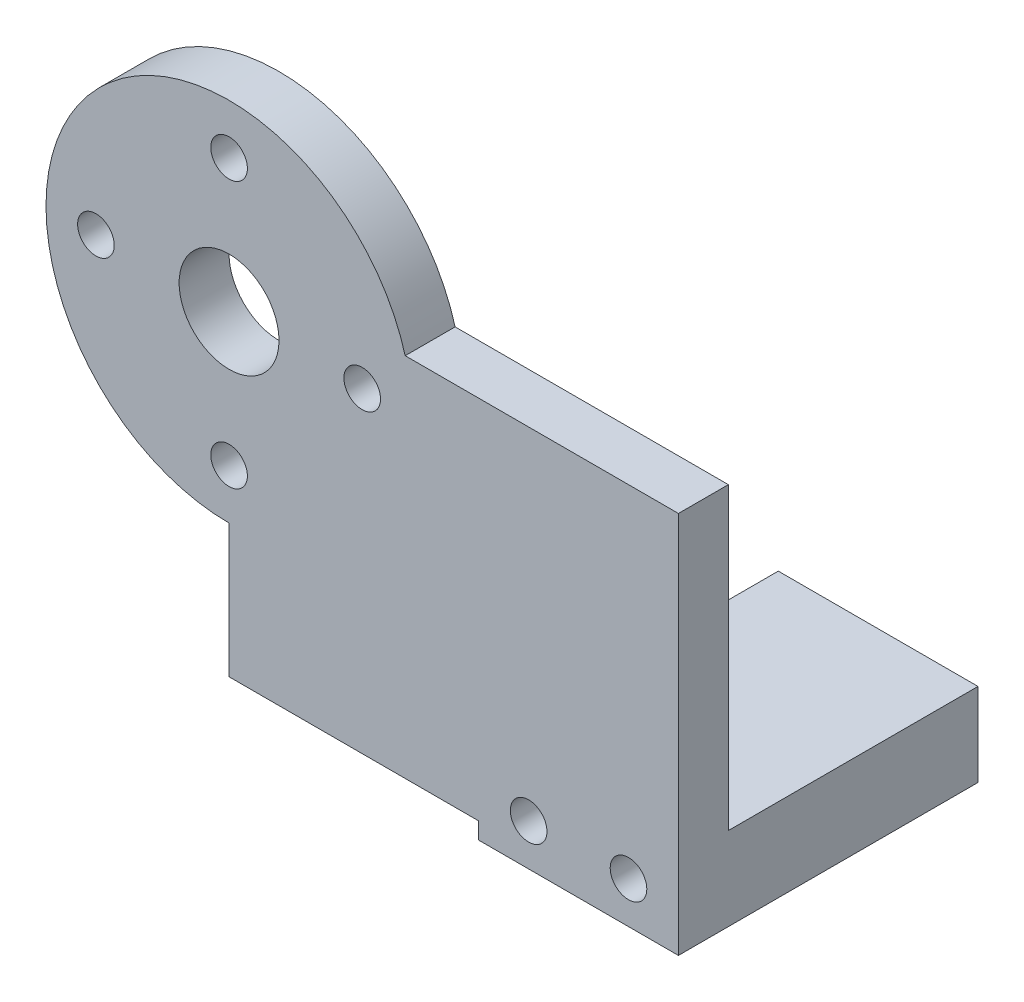
ISO-10303-21;
HEADER;
FILE_DESCRIPTION(('STEP AP214'),'2;1');
FILE_NAME('part.step','',(''),(''),'','','');
FILE_SCHEMA(('AUTOMOTIVE_DESIGN { 1 0 10303 214 1 1 1 1 }'));
ENDSEC;
DATA;
#1=APPLICATION_CONTEXT('core data for automotive mechanical design processes');
#2=APPLICATION_PROTOCOL_DEFINITION('international standard','automotive_design',2000,#1);
#3=PRODUCT_CONTEXT('',#1,'mechanical');
#4=PRODUCT('Part','Part','',(#3));
#5=PRODUCT_RELATED_PRODUCT_CATEGORY('part','',(#4));
#6=PRODUCT_DEFINITION_FORMATION('','',#4);
#7=PRODUCT_DEFINITION_CONTEXT('part definition',#1,'design');
#8=PRODUCT_DEFINITION('design','',#6,#7);
#9=PRODUCT_DEFINITION_SHAPE('','',#8);
#10=(LENGTH_UNIT() NAMED_UNIT(*) SI_UNIT(.MILLI.,.METRE.));
#11=(NAMED_UNIT(*) PLANE_ANGLE_UNIT() SI_UNIT($,.RADIAN.));
#12=(NAMED_UNIT(*) SI_UNIT($,.STERADIAN.) SOLID_ANGLE_UNIT());
#13=UNCERTAINTY_MEASURE_WITH_UNIT(LENGTH_MEASURE(1.E-05),#10,'distance_accuracy_value','');
#14=(GEOMETRIC_REPRESENTATION_CONTEXT(3) GLOBAL_UNCERTAINTY_ASSIGNED_CONTEXT((#13)) GLOBAL_UNIT_ASSIGNED_CONTEXT((#10,
#11,#12)) REPRESENTATION_CONTEXT('',''));
#15=CARTESIAN_POINT('',(0.,0.,0.));
#16=DIRECTION('',(0.,0.,1.));
#17=DIRECTION('',(1.,0.,0.));
#18=AXIS2_PLACEMENT_3D('',#15,#16,#17);
#19=CARTESIAN_POINT('',(0.,0.,15.));
#20=DIRECTION('',(0.,0.,1.));
#21=DIRECTION('',(1.,0.,0.));
#22=AXIS2_PLACEMENT_3D('',#19,#20,#21);
#23=PLANE('',#22);
#24=CARTESIAN_POINT('',(0.,-8.,15.));
#25=DIRECTION('',(0.,0.,1.));
#26=DIRECTION('',(1.,0.,0.));
#27=AXIS2_PLACEMENT_3D('',#24,#25,#26);
#28=CIRCLE('',#27,1.1);
#29=CARTESIAN_POINT('',(1.1,-8.,15.));
#30=VERTEX_POINT('',#29);
#31=EDGE_CURVE('E250',#30,#30,#28,.F.);
#32=ORIENTED_EDGE('',*,*,#31,.F.);
#33=EDGE_LOOP('',(#32));
#34=FACE_BOUND('',#33,.T.);
#35=CARTESIAN_POINT('',(0.,8.,15.));
#36=DIRECTION('',(0.,0.,1.));
#37=DIRECTION('',(1.,0.,0.));
#38=AXIS2_PLACEMENT_3D('',#35,#36,#37);
#39=CIRCLE('',#38,1.1);
#40=CARTESIAN_POINT('',(1.1,8.,15.));
#41=VERTEX_POINT('',#40);
#42=EDGE_CURVE('E243',#41,#41,#39,.F.);
#43=ORIENTED_EDGE('',*,*,#42,.F.);
#44=EDGE_LOOP('',(#43));
#45=FACE_BOUND('',#44,.T.);
#46=CARTESIAN_POINT('',(-8.,0.,15.));
#47=DIRECTION('',(0.,0.,1.));
#48=DIRECTION('',(1.,0.,0.));
#49=AXIS2_PLACEMENT_3D('',#46,#47,#48);
#50=CIRCLE('',#49,1.1);
#51=CARTESIAN_POINT('',(-6.9,0.,15.));
#52=VERTEX_POINT('',#51);
#53=EDGE_CURVE('E239',#52,#52,#50,.F.);
#54=ORIENTED_EDGE('',*,*,#53,.F.);
#55=EDGE_LOOP('',(#54));
#56=FACE_BOUND('',#55,.T.);
#57=CARTESIAN_POINT('',(8.,0.,15.));
#58=DIRECTION('',(0.,0.,1.));
#59=DIRECTION('',(1.,0.,0.));
#60=AXIS2_PLACEMENT_3D('',#57,#58,#59);
#61=CIRCLE('',#60,1.1);
#62=CARTESIAN_POINT('',(9.1,0.,15.));
#63=VERTEX_POINT('',#62);
#64=EDGE_CURVE('E221',#63,#63,#61,.F.);
#65=ORIENTED_EDGE('',*,*,#64,.F.);
#66=EDGE_LOOP('',(#65));
#67=FACE_BOUND('',#66,.T.);
#68=CARTESIAN_POINT('',(0.,0.,15.));
#69=DIRECTION('',(0.,0.,1.));
#70=DIRECTION('',(1.,0.,0.));
#71=AXIS2_PLACEMENT_3D('',#68,#69,#70);
#72=CIRCLE('',#71,3.);
#73=CARTESIAN_POINT('',(3.,0.,15.));
#74=VERTEX_POINT('',#73);
#75=EDGE_CURVE('E254',#74,#74,#72,.F.);
#76=ORIENTED_EDGE('',*,*,#75,.F.);
#77=EDGE_LOOP('',(#76));
#78=FACE_BOUND('',#77,.T.);
#79=DIRECTION('',(0.,1.,0.));
#80=VECTOR('',#79,1.);
#81=CARTESIAN_POINT('',(15.,0.,15.));
#82=LINE('',#81,#80);
#83=CARTESIAN_POINT('',(15.,-19.,15.));
#84=VERTEX_POINT('',#83);
#85=CARTESIAN_POINT('',(15.,-15.,15.));
#86=VERTEX_POINT('',#85);
#87=EDGE_CURVE('E145',#84,#86,#82,.T.);
#88=ORIENTED_EDGE('',*,*,#87,.F.);
#89=DIRECTION('',(1.,0.,0.));
#90=VECTOR('',#89,1.);
#91=CARTESIAN_POINT('',(0.,-19.,15.));
#92=LINE('',#91,#90);
#93=CARTESIAN_POINT('',(0.,-19.,15.));
#94=VERTEX_POINT('',#93);
#95=EDGE_CURVE('E168',#94,#84,#92,.T.);
#96=ORIENTED_EDGE('',*,*,#95,.F.);
#97=DIRECTION('',(0.,-1.,0.));
#98=VECTOR('',#97,1.);
#99=CARTESIAN_POINT('',(0.,-19.,15.));
#100=LINE('',#99,#98);
#101=CARTESIAN_POINT('',(0.,-11.,15.));
#102=VERTEX_POINT('',#101);
#103=EDGE_CURVE('E146',#102,#94,#100,.T.);
#104=ORIENTED_EDGE('',*,*,#103,.F.);
#105=CARTESIAN_POINT('',(0.,0.,15.));
#106=DIRECTION('',(0.,0.,1.));
#107=DIRECTION('',(1.,0.,0.));
#108=AXIS2_PLACEMENT_3D('',#105,#106,#107);
#109=CIRCLE('',#108,11.);
#110=CARTESIAN_POINT('',(10.5830052442584,3.,15.));
#111=VERTEX_POINT('',#110);
#112=EDGE_CURVE('E189',#111,#102,#109,.T.);
#113=ORIENTED_EDGE('',*,*,#112,.F.);
#114=DIRECTION('',(-1.,0.,0.));
#115=VECTOR('',#114,1.);
#116=CARTESIAN_POINT('',(0.,3.,15.));
#117=LINE('',#116,#115);
#118=CARTESIAN_POINT('',(27.,3.,15.));
#119=VERTEX_POINT('',#118);
#120=EDGE_CURVE('E160',#119,#111,#117,.T.);
#121=ORIENTED_EDGE('',*,*,#120,.F.);
#122=DIRECTION('',(0.,1.,0.));
#123=VECTOR('',#122,1.);
#124=CARTESIAN_POINT('',(27.,-19.,15.));
#125=LINE('',#124,#123);
#126=CARTESIAN_POINT('',(27.,-15.,15.));
#127=VERTEX_POINT('',#126);
#128=EDGE_CURVE('E68',#127,#119,#125,.T.);
#129=ORIENTED_EDGE('',*,*,#128,.F.);
#130=DIRECTION('',(1.,0.,0.));
#131=VECTOR('',#130,1.);
#132=CARTESIAN_POINT('',(0.,-15.,15.));
#133=LINE('',#132,#131);
#134=EDGE_CURVE('E11',#86,#127,#133,.T.);
#135=ORIENTED_EDGE('',*,*,#134,.F.);
#136=EDGE_LOOP('',(#88,#96,#104,#113,#121,#129,#135));
#137=FACE_BOUND('',#136,.T.);
#138=ADVANCED_FACE('F44',(#34,#45,#56,#67,#78,#137),#23,.F.);
#139=CARTESIAN_POINT('',(0.,-19.,18.));
#140=DIRECTION('',(0.,1.,0.));
#141=DIRECTION('',(0.,0.,1.));
#142=AXIS2_PLACEMENT_3D('',#139,#140,#141);
#143=PLANE('',#142);
#144=DIRECTION('',(0.,0.,-1.));
#145=VECTOR('',#144,1.);
#146=CARTESIAN_POINT('',(15.,-19.,18.));
#147=LINE('',#146,#145);
#148=CARTESIAN_POINT('',(15.,-19.,18.));
#149=VERTEX_POINT('',#148);
#150=EDGE_CURVE('E54',#149,#84,#147,.T.);
#151=ORIENTED_EDGE('',*,*,#150,.F.);
#152=DIRECTION('',(1.,0.,0.));
#153=VECTOR('',#152,1.);
#154=CARTESIAN_POINT('',(0.,-19.,18.));
#155=LINE('',#154,#153);
#156=CARTESIAN_POINT('',(0.,-19.,18.));
#157=VERTEX_POINT('',#156);
#158=EDGE_CURVE('E121',#157,#149,#155,.T.);
#159=ORIENTED_EDGE('',*,*,#158,.F.);
#160=DIRECTION('',(0.,0.,-1.));
#161=VECTOR('',#160,1.);
#162=CARTESIAN_POINT('',(0.,-19.,18.));
#163=LINE('',#162,#161);
#164=EDGE_CURVE('E182',#157,#94,#163,.T.);
#165=ORIENTED_EDGE('',*,*,#164,.T.);
#166=ORIENTED_EDGE('',*,*,#95,.T.);
#167=EDGE_LOOP('',(#151,#159,#165,#166));
#168=FACE_BOUND('',#167,.T.);
#169=ADVANCED_FACE('F299',(#168),#143,.F.);
#170=CARTESIAN_POINT('',(0.,0.,18.));
#171=DIRECTION('',(0.,0.,-1.));
#172=DIRECTION('',(-1.,0.,0.));
#173=AXIS2_PLACEMENT_3D('',#170,#171,#172);
#174=CYLINDRICAL_SURFACE('',#173,11.);
#175=DIRECTION('',(0.,0.,-1.));
#176=VECTOR('',#175,1.);
#177=CARTESIAN_POINT('',(0.,-11.,18.));
#178=LINE('',#177,#176);
#179=CARTESIAN_POINT('',(0.,-11.,18.));
#180=VERTEX_POINT('',#179);
#181=EDGE_CURVE('E194',#180,#102,#178,.T.);
#182=ORIENTED_EDGE('',*,*,#181,.F.);
#183=CARTESIAN_POINT('',(0.,0.,18.));
#184=DIRECTION('',(0.,0.,1.));
#185=DIRECTION('',(1.,0.,0.));
#186=AXIS2_PLACEMENT_3D('',#183,#184,#185);
#187=CIRCLE('',#186,11.);
#188=CARTESIAN_POINT('',(10.5830052442584,3.,18.));
#189=VERTEX_POINT('',#188);
#190=EDGE_CURVE('E186',#189,#180,#187,.T.);
#191=ORIENTED_EDGE('',*,*,#190,.F.);
#192=DIRECTION('',(0.,0.,-1.));
#193=VECTOR('',#192,1.);
#194=CARTESIAN_POINT('',(10.5830052442584,3.,18.));
#195=LINE('',#194,#193);
#196=EDGE_CURVE('E183',#111,#189,#195,.F.);
#197=ORIENTED_EDGE('',*,*,#196,.F.);
#198=ORIENTED_EDGE('',*,*,#112,.T.);
#199=EDGE_LOOP('',(#182,#191,#197,#198));
#200=FACE_BOUND('',#199,.T.);
#201=ADVANCED_FACE('F50',(#200),#174,.T.);
#202=CARTESIAN_POINT('',(0.,0.,18.));
#203=DIRECTION('',(0.,0.,1.));
#204=DIRECTION('',(1.,0.,0.));
#205=AXIS2_PLACEMENT_3D('',#202,#203,#204);
#206=PLANE('',#205);
#207=CARTESIAN_POINT('',(18.,-17.5,18.));
#208=DIRECTION('',(0.,0.,1.));
#209=DIRECTION('',(1.,0.,0.));
#210=AXIS2_PLACEMENT_3D('',#207,#208,#209);
#211=CIRCLE('',#210,1.1);
#212=CARTESIAN_POINT('',(19.1,-17.5,18.));
#213=VERTEX_POINT('',#212);
#214=EDGE_CURVE('E204',#213,#213,#211,.T.);
#215=ORIENTED_EDGE('',*,*,#214,.F.);
#216=EDGE_LOOP('',(#215));
#217=FACE_BOUND('',#216,.T.);
#218=CARTESIAN_POINT('',(24.,-17.5,18.));
#219=DIRECTION('',(0.,0.,1.));
#220=DIRECTION('',(1.,0.,0.));
#221=AXIS2_PLACEMENT_3D('',#218,#219,#220);
#222=CIRCLE('',#221,1.1);
#223=CARTESIAN_POINT('',(25.1,-17.5,18.));
#224=VERTEX_POINT('',#223);
#225=EDGE_CURVE('E215',#224,#224,#222,.T.);
#226=ORIENTED_EDGE('',*,*,#225,.F.);
#227=EDGE_LOOP('',(#226));
#228=FACE_BOUND('',#227,.T.);
#229=CARTESIAN_POINT('',(0.,-8.,18.));
#230=DIRECTION('',(0.,0.,1.));
#231=DIRECTION('',(1.,0.,0.));
#232=AXIS2_PLACEMENT_3D('',#229,#230,#231);
#233=CIRCLE('',#232,1.1);
#234=CARTESIAN_POINT('',(1.1,-8.,18.));
#235=VERTEX_POINT('',#234);
#236=EDGE_CURVE('E219',#235,#235,#233,.T.);
#237=ORIENTED_EDGE('',*,*,#236,.F.);
#238=EDGE_LOOP('',(#237));
#239=FACE_BOUND('',#238,.T.);
#240=CARTESIAN_POINT('',(0.,8.,18.));
#241=DIRECTION('',(0.,0.,1.));
#242=DIRECTION('',(1.,0.,0.));
#243=AXIS2_PLACEMENT_3D('',#240,#241,#242);
#244=CIRCLE('',#243,1.1);
#245=CARTESIAN_POINT('',(1.1,8.,18.));
#246=VERTEX_POINT('',#245);
#247=EDGE_CURVE('E223',#246,#246,#244,.T.);
#248=ORIENTED_EDGE('',*,*,#247,.F.);
#249=EDGE_LOOP('',(#248));
#250=FACE_BOUND('',#249,.T.);
#251=CARTESIAN_POINT('',(-8.,0.,18.));
#252=DIRECTION('',(0.,0.,1.));
#253=DIRECTION('',(1.,0.,0.));
#254=AXIS2_PLACEMENT_3D('',#251,#252,#253);
#255=CIRCLE('',#254,1.1);
#256=CARTESIAN_POINT('',(-6.9,0.,18.));
#257=VERTEX_POINT('',#256);
#258=EDGE_CURVE('E229',#257,#257,#255,.T.);
#259=ORIENTED_EDGE('',*,*,#258,.F.);
#260=EDGE_LOOP('',(#259));
#261=FACE_BOUND('',#260,.T.);
#262=CARTESIAN_POINT('',(8.,0.,18.));
#263=DIRECTION('',(0.,0.,1.));
#264=DIRECTION('',(1.,0.,0.));
#265=AXIS2_PLACEMENT_3D('',#262,#263,#264);
#266=CIRCLE('',#265,1.1);
#267=CARTESIAN_POINT('',(9.1,0.,18.));
#268=VERTEX_POINT('',#267);
#269=EDGE_CURVE('E209',#268,#268,#266,.T.);
#270=ORIENTED_EDGE('',*,*,#269,.F.);
#271=EDGE_LOOP('',(#270));
#272=FACE_BOUND('',#271,.T.);
#273=CARTESIAN_POINT('',(0.,0.,18.));
#274=DIRECTION('',(0.,0.,1.));
#275=DIRECTION('',(1.,0.,0.));
#276=AXIS2_PLACEMENT_3D('',#273,#274,#275);
#277=CIRCLE('',#276,3.);
#278=CARTESIAN_POINT('',(3.,0.,18.));
#279=VERTEX_POINT('',#278);
#280=EDGE_CURVE('E253',#279,#279,#277,.T.);
#281=ORIENTED_EDGE('',*,*,#280,.F.);
#282=EDGE_LOOP('',(#281));
#283=FACE_BOUND('',#282,.T.);
#284=ORIENTED_EDGE('',*,*,#158,.T.);
#285=DIRECTION('',(0.,-1.,0.));
#286=VECTOR('',#285,1.);
#287=CARTESIAN_POINT('',(15.,-20.,18.));
#288=LINE('',#287,#286);
#289=CARTESIAN_POINT('',(15.,-20.,18.));
#290=VERTEX_POINT('',#289);
#291=EDGE_CURVE('E120',#149,#290,#288,.T.);
#292=ORIENTED_EDGE('',*,*,#291,.T.);
#293=DIRECTION('',(1.,0.,0.));
#294=VECTOR('',#293,1.);
#295=CARTESIAN_POINT('',(15.,-20.,18.));
#296=LINE('',#295,#294);
#297=CARTESIAN_POINT('',(27.,-20.,18.));
#298=VERTEX_POINT('',#297);
#299=EDGE_CURVE('E116',#290,#298,#296,.T.);
#300=ORIENTED_EDGE('',*,*,#299,.T.);
#301=DIRECTION('',(0.,1.,0.));
#302=VECTOR('',#301,1.);
#303=CARTESIAN_POINT('',(27.,-19.,18.));
#304=LINE('',#303,#302);
#305=CARTESIAN_POINT('',(27.,3.,18.));
#306=VERTEX_POINT('',#305);
#307=EDGE_CURVE('E159',#298,#306,#304,.T.);
#308=ORIENTED_EDGE('',*,*,#307,.T.);
#309=DIRECTION('',(-1.,0.,0.));
#310=VECTOR('',#309,1.);
#311=CARTESIAN_POINT('',(0.,3.,18.));
#312=LINE('',#311,#310);
#313=EDGE_CURVE('E162',#306,#189,#312,.T.);
#314=ORIENTED_EDGE('',*,*,#313,.T.);
#315=ORIENTED_EDGE('',*,*,#190,.T.);
#316=DIRECTION('',(0.,-1.,0.));
#317=VECTOR('',#316,1.);
#318=CARTESIAN_POINT('',(0.,-19.,18.));
#319=LINE('',#318,#317);
#320=EDGE_CURVE('E152',#180,#157,#319,.T.);
#321=ORIENTED_EDGE('',*,*,#320,.T.);
#322=EDGE_LOOP('',(#284,#292,#300,#308,#314,#315,#321));
#323=FACE_BOUND('',#322,.T.);
#324=ADVANCED_FACE('F119',(#217,#228,#239,#250,#261,#272,#283,#323),#206,.T.);
#325=CARTESIAN_POINT('',(0.,-19.,18.));
#326=DIRECTION('',(1.,0.,0.));
#327=DIRECTION('',(0.,0.,-1.));
#328=AXIS2_PLACEMENT_3D('',#325,#326,#327);
#329=PLANE('',#328);
#330=ORIENTED_EDGE('',*,*,#320,.F.);
#331=ORIENTED_EDGE('',*,*,#181,.T.);
#332=ORIENTED_EDGE('',*,*,#103,.T.);
#333=ORIENTED_EDGE('',*,*,#164,.F.);
#334=EDGE_LOOP('',(#330,#331,#332,#333));
#335=FACE_BOUND('',#334,.T.);
#336=ADVANCED_FACE('F313',(#335),#329,.F.);
#337=CARTESIAN_POINT('',(0.,3.,18.));
#338=DIRECTION('',(0.,-1.,0.));
#339=DIRECTION('',(0.,0.,-1.));
#340=AXIS2_PLACEMENT_3D('',#337,#338,#339);
#341=PLANE('',#340);
#342=ORIENTED_EDGE('',*,*,#120,.T.);
#343=ORIENTED_EDGE('',*,*,#196,.T.);
#344=ORIENTED_EDGE('',*,*,#313,.F.);
#345=DIRECTION('',(0.,0.,-1.));
#346=VECTOR('',#345,1.);
#347=CARTESIAN_POINT('',(27.,3.,18.));
#348=LINE('',#347,#346);
#349=EDGE_CURVE('E170',#306,#119,#348,.T.);
#350=ORIENTED_EDGE('',*,*,#349,.T.);
#351=EDGE_LOOP('',(#342,#343,#344,#350));
#352=FACE_BOUND('',#351,.T.);
#353=ADVANCED_FACE('F314',(#352),#341,.F.);
#354=CARTESIAN_POINT('',(27.,-19.,18.));
#355=DIRECTION('',(-1.,0.,0.));
#356=DIRECTION('',(0.,0.,1.));
#357=AXIS2_PLACEMENT_3D('',#354,#355,#356);
#358=PLANE('',#357);
#359=DIRECTION('',(0.,0.,-1.));
#360=VECTOR('',#359,1.);
#361=CARTESIAN_POINT('',(27.,-15.,18.));
#362=LINE('',#361,#360);
#363=CARTESIAN_POINT('',(27.,-15.,0.));
#364=VERTEX_POINT('',#363);
#365=EDGE_CURVE('E147',#127,#364,#362,.T.);
#366=ORIENTED_EDGE('',*,*,#365,.F.);
#367=ORIENTED_EDGE('',*,*,#128,.T.);
#368=ORIENTED_EDGE('',*,*,#349,.F.);
#369=ORIENTED_EDGE('',*,*,#307,.F.);
#370=DIRECTION('',(0.,0.,-1.));
#371=VECTOR('',#370,1.);
#372=CARTESIAN_POINT('',(27.,-20.,18.));
#373=LINE('',#372,#371);
#374=CARTESIAN_POINT('',(27.,-20.,0.));
#375=VERTEX_POINT('',#374);
#376=EDGE_CURVE('E138',#298,#375,#373,.T.);
#377=ORIENTED_EDGE('',*,*,#376,.T.);
#378=DIRECTION('',(0.,1.,0.));
#379=VECTOR('',#378,1.);
#380=CARTESIAN_POINT('',(27.,-20.,0.));
#381=LINE('',#380,#379);
#382=EDGE_CURVE('E262',#375,#364,#381,.T.);
#383=ORIENTED_EDGE('',*,*,#382,.T.);
#384=EDGE_LOOP('',(#366,#367,#368,#369,#377,#383));
#385=FACE_BOUND('',#384,.T.);
#386=ADVANCED_FACE('F278',(#385),#358,.F.);
#387=CARTESIAN_POINT('',(15.,-15.,18.));
#388=DIRECTION('',(0.,-1.,0.));
#389=DIRECTION('',(0.,0.,-1.));
#390=AXIS2_PLACEMENT_3D('',#387,#388,#389);
#391=PLANE('',#390);
#392=DIRECTION('',(0.,0.,-1.));
#393=VECTOR('',#392,1.);
#394=CARTESIAN_POINT('',(15.,-15.,18.));
#395=LINE('',#394,#393);
#396=CARTESIAN_POINT('',(15.,-15.,0.));
#397=VERTEX_POINT('',#396);
#398=EDGE_CURVE('E136',#86,#397,#395,.T.);
#399=ORIENTED_EDGE('',*,*,#398,.F.);
#400=ORIENTED_EDGE('',*,*,#134,.T.);
#401=ORIENTED_EDGE('',*,*,#365,.T.);
#402=DIRECTION('',(-1.,0.,0.));
#403=VECTOR('',#402,1.);
#404=CARTESIAN_POINT('',(15.,-15.,0.));
#405=LINE('',#404,#403);
#406=EDGE_CURVE('E126',#364,#397,#405,.T.);
#407=ORIENTED_EDGE('',*,*,#406,.T.);
#408=EDGE_LOOP('',(#399,#400,#401,#407));
#409=FACE_BOUND('',#408,.T.);
#410=ADVANCED_FACE('F277',(#409),#391,.F.);
#411=CARTESIAN_POINT('',(15.,-20.,18.));
#412=DIRECTION('',(1.,0.,0.));
#413=DIRECTION('',(0.,0.,-1.));
#414=AXIS2_PLACEMENT_3D('',#411,#412,#413);
#415=PLANE('',#414);
#416=ORIENTED_EDGE('',*,*,#150,.T.);
#417=ORIENTED_EDGE('',*,*,#87,.T.);
#418=ORIENTED_EDGE('',*,*,#398,.T.);
#419=DIRECTION('',(0.,-1.,0.));
#420=VECTOR('',#419,1.);
#421=CARTESIAN_POINT('',(15.,-20.,0.));
#422=LINE('',#421,#420);
#423=CARTESIAN_POINT('',(15.,-20.,0.));
#424=VERTEX_POINT('',#423);
#425=EDGE_CURVE('E142',#397,#424,#422,.T.);
#426=ORIENTED_EDGE('',*,*,#425,.T.);
#427=DIRECTION('',(0.,0.,-1.));
#428=VECTOR('',#427,1.);
#429=CARTESIAN_POINT('',(15.,-20.,18.));
#430=LINE('',#429,#428);
#431=EDGE_CURVE('E133',#290,#424,#430,.T.);
#432=ORIENTED_EDGE('',*,*,#431,.F.);
#433=ORIENTED_EDGE('',*,*,#291,.F.);
#434=EDGE_LOOP('',(#416,#417,#418,#426,#432,#433));
#435=FACE_BOUND('',#434,.T.);
#436=ADVANCED_FACE('F137',(#435),#415,.F.);
#437=CARTESIAN_POINT('',(15.,-20.,18.));
#438=DIRECTION('',(0.,1.,0.));
#439=DIRECTION('',(0.,0.,1.));
#440=AXIS2_PLACEMENT_3D('',#437,#438,#439);
#441=PLANE('',#440);
#442=DIRECTION('',(1.,0.,0.));
#443=VECTOR('',#442,1.);
#444=CARTESIAN_POINT('',(15.,-20.,0.));
#445=LINE('',#444,#443);
#446=EDGE_CURVE('E261',#424,#375,#445,.T.);
#447=ORIENTED_EDGE('',*,*,#446,.T.);
#448=ORIENTED_EDGE('',*,*,#376,.F.);
#449=ORIENTED_EDGE('',*,*,#299,.F.);
#450=ORIENTED_EDGE('',*,*,#431,.T.);
#451=EDGE_LOOP('',(#447,#448,#449,#450));
#452=FACE_BOUND('',#451,.T.);
#453=ADVANCED_FACE('F135',(#452),#441,.F.);
#454=CARTESIAN_POINT('',(0.,0.,0.));
#455=DIRECTION('',(0.,0.,-1.));
#456=DIRECTION('',(-1.,0.,0.));
#457=AXIS2_PLACEMENT_3D('',#454,#455,#456);
#458=PLANE('',#457);
#459=CARTESIAN_POINT('',(18.,-17.5,0.));
#460=DIRECTION('',(0.,0.,-1.));
#461=DIRECTION('',(-1.,0.,0.));
#462=AXIS2_PLACEMENT_3D('',#459,#460,#461);
#463=CIRCLE('',#462,1.1);
#464=CARTESIAN_POINT('',(16.9,-17.5,0.));
#465=VERTEX_POINT('',#464);
#466=EDGE_CURVE('E47',#465,#465,#463,.F.);
#467=ORIENTED_EDGE('',*,*,#466,.T.);
#468=EDGE_LOOP('',(#467));
#469=FACE_BOUND('',#468,.T.);
#470=CARTESIAN_POINT('',(24.,-17.5,0.));
#471=DIRECTION('',(0.,0.,-1.));
#472=DIRECTION('',(-1.,0.,0.));
#473=AXIS2_PLACEMENT_3D('',#470,#471,#472);
#474=CIRCLE('',#473,1.1);
#475=CARTESIAN_POINT('',(22.9,-17.5,0.));
#476=VERTEX_POINT('',#475);
#477=EDGE_CURVE('E203',#476,#476,#474,.F.);
#478=ORIENTED_EDGE('',*,*,#477,.T.);
#479=EDGE_LOOP('',(#478));
#480=FACE_BOUND('',#479,.T.);
#481=ORIENTED_EDGE('',*,*,#425,.F.);
#482=ORIENTED_EDGE('',*,*,#406,.F.);
#483=ORIENTED_EDGE('',*,*,#382,.F.);
#484=ORIENTED_EDGE('',*,*,#446,.F.);
#485=EDGE_LOOP('',(#481,#482,#483,#484));
#486=FACE_BOUND('',#485,.T.);
#487=ADVANCED_FACE('F285',(#469,#480,#486),#458,.T.);
#488=CARTESIAN_POINT('',(0.,0.,18.));
#489=DIRECTION('',(0.,0.,-1.));
#490=DIRECTION('',(-1.,0.,0.));
#491=AXIS2_PLACEMENT_3D('',#488,#489,#490);
#492=CYLINDRICAL_SURFACE('',#491,3.);
#493=ORIENTED_EDGE('',*,*,#280,.T.);
#494=EDGE_LOOP('',(#493));
#495=FACE_BOUND('',#494,.T.);
#496=ORIENTED_EDGE('',*,*,#75,.T.);
#497=EDGE_LOOP('',(#496));
#498=FACE_BOUND('',#497,.T.);
#499=ADVANCED_FACE('F284',(#495,#498),#492,.F.);
#500=CARTESIAN_POINT('',(8.,0.,18.));
#501=DIRECTION('',(0.,0.,-1.));
#502=DIRECTION('',(-1.,0.,0.));
#503=AXIS2_PLACEMENT_3D('',#500,#501,#502);
#504=CYLINDRICAL_SURFACE('',#503,1.1);
#505=ORIENTED_EDGE('',*,*,#269,.T.);
#506=EDGE_LOOP('',(#505));
#507=FACE_BOUND('',#506,.T.);
#508=ORIENTED_EDGE('',*,*,#64,.T.);
#509=EDGE_LOOP('',(#508));
#510=FACE_BOUND('',#509,.T.);
#511=ADVANCED_FACE('F295',(#507,#510),#504,.F.);
#512=CARTESIAN_POINT('',(-8.,0.,18.));
#513=DIRECTION('',(0.,0.,-1.));
#514=DIRECTION('',(-1.,0.,0.));
#515=AXIS2_PLACEMENT_3D('',#512,#513,#514);
#516=CYLINDRICAL_SURFACE('',#515,1.1);
#517=ORIENTED_EDGE('',*,*,#258,.T.);
#518=EDGE_LOOP('',(#517));
#519=FACE_BOUND('',#518,.T.);
#520=ORIENTED_EDGE('',*,*,#53,.T.);
#521=EDGE_LOOP('',(#520));
#522=FACE_BOUND('',#521,.T.);
#523=ADVANCED_FACE('F351',(#519,#522),#516,.F.);
#524=CARTESIAN_POINT('',(0.,8.,18.));
#525=DIRECTION('',(0.,0.,-1.));
#526=DIRECTION('',(-1.,0.,0.));
#527=AXIS2_PLACEMENT_3D('',#524,#525,#526);
#528=CYLINDRICAL_SURFACE('',#527,1.1);
#529=ORIENTED_EDGE('',*,*,#247,.T.);
#530=EDGE_LOOP('',(#529));
#531=FACE_BOUND('',#530,.T.);
#532=ORIENTED_EDGE('',*,*,#42,.T.);
#533=EDGE_LOOP('',(#532));
#534=FACE_BOUND('',#533,.T.);
#535=ADVANCED_FACE('F364',(#531,#534),#528,.F.);
#536=CARTESIAN_POINT('',(0.,-8.,18.));
#537=DIRECTION('',(0.,0.,-1.));
#538=DIRECTION('',(-1.,0.,0.));
#539=AXIS2_PLACEMENT_3D('',#536,#537,#538);
#540=CYLINDRICAL_SURFACE('',#539,1.1);
#541=ORIENTED_EDGE('',*,*,#236,.T.);
#542=EDGE_LOOP('',(#541));
#543=FACE_BOUND('',#542,.T.);
#544=ORIENTED_EDGE('',*,*,#31,.T.);
#545=EDGE_LOOP('',(#544));
#546=FACE_BOUND('',#545,.T.);
#547=ADVANCED_FACE('F374',(#543,#546),#540,.F.);
#548=CARTESIAN_POINT('',(24.,-17.5,18.));
#549=DIRECTION('',(0.,0.,-1.));
#550=DIRECTION('',(-1.,0.,0.));
#551=AXIS2_PLACEMENT_3D('',#548,#549,#550);
#552=CYLINDRICAL_SURFACE('',#551,1.1);
#553=ORIENTED_EDGE('',*,*,#477,.F.);
#554=EDGE_LOOP('',(#553));
#555=FACE_BOUND('',#554,.T.);
#556=ORIENTED_EDGE('',*,*,#225,.T.);
#557=EDGE_LOOP('',(#556));
#558=FACE_BOUND('',#557,.T.);
#559=ADVANCED_FACE('F384',(#555,#558),#552,.F.);
#560=CARTESIAN_POINT('',(18.,-17.5,18.));
#561=DIRECTION('',(0.,0.,-1.));
#562=DIRECTION('',(-1.,0.,0.));
#563=AXIS2_PLACEMENT_3D('',#560,#561,#562);
#564=CYLINDRICAL_SURFACE('',#563,1.1);
#565=ORIENTED_EDGE('',*,*,#466,.F.);
#566=EDGE_LOOP('',(#565));
#567=FACE_BOUND('',#566,.T.);
#568=ORIENTED_EDGE('',*,*,#214,.T.);
#569=EDGE_LOOP('',(#568));
#570=FACE_BOUND('',#569,.T.);
#571=ADVANCED_FACE('F394',(#567,#570),#564,.F.);
#572=CLOSED_SHELL('',(#138,#169,#201,#324,#336,#353,#386,#410,#436,#453,#487,#499,#511,#523,
#535,#547,#559,#571));
#573=MANIFOLD_SOLID_BREP('B2',#572);
#574=ADVANCED_BREP_SHAPE_REPRESENTATION('',(#18,#573),#14);
#575=SHAPE_DEFINITION_REPRESENTATION(#9,#574);
ENDSEC;
END-ISO-10303-21;
